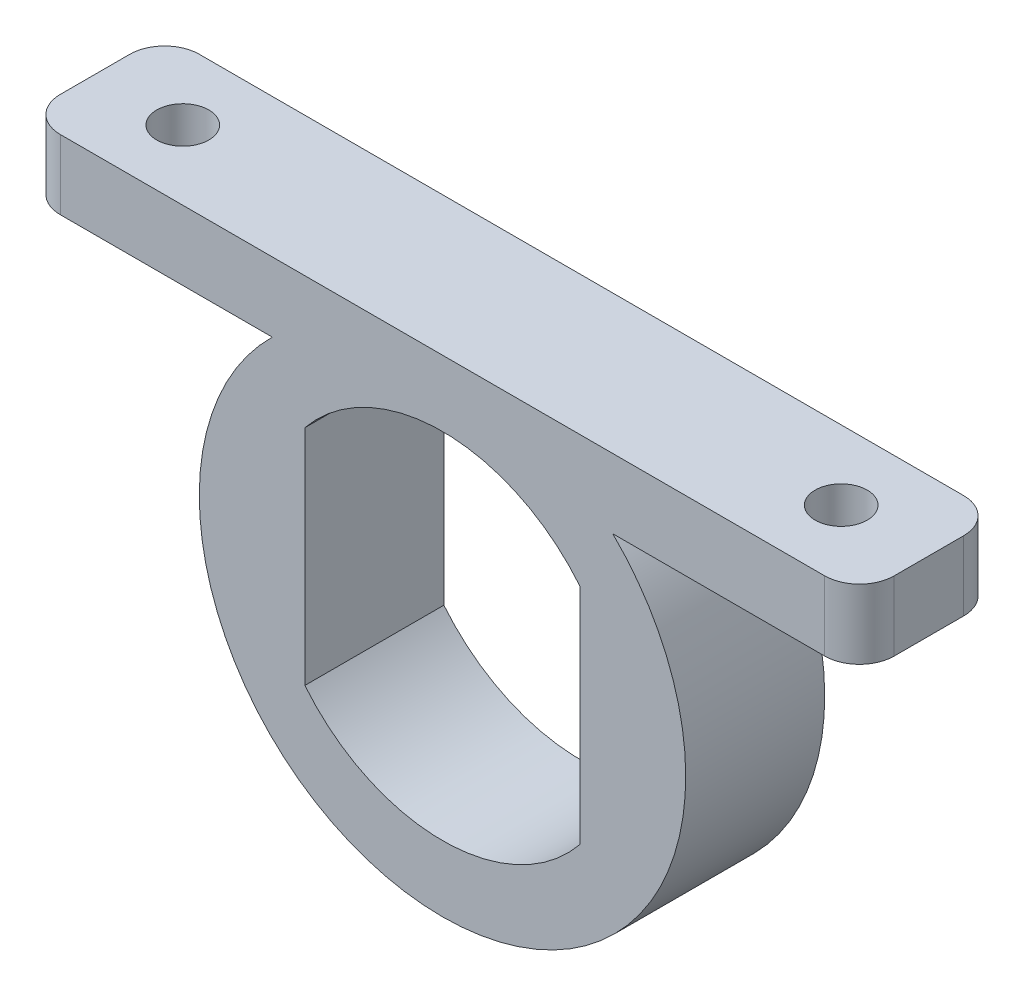
ISO-10303-21;
HEADER;
FILE_DESCRIPTION(('STEP AP214'),'2;1');
FILE_NAME('part.step','',(''),(''),'','','');
FILE_SCHEMA(('AUTOMOTIVE_DESIGN { 1 0 10303 214 1 1 1 1 }'));
ENDSEC;
DATA;
#1=APPLICATION_CONTEXT('core data for automotive mechanical design processes');
#2=APPLICATION_PROTOCOL_DEFINITION('international standard','automotive_design',2000,#1);
#3=PRODUCT_CONTEXT('',#1,'mechanical');
#4=PRODUCT('Part','Part','',(#3));
#5=PRODUCT_RELATED_PRODUCT_CATEGORY('part','',(#4));
#6=PRODUCT_DEFINITION_FORMATION('','',#4);
#7=PRODUCT_DEFINITION_CONTEXT('part definition',#1,'design');
#8=PRODUCT_DEFINITION('design','',#6,#7);
#9=PRODUCT_DEFINITION_SHAPE('','',#8);
#10=(LENGTH_UNIT() NAMED_UNIT(*) SI_UNIT(.MILLI.,.METRE.));
#11=(NAMED_UNIT(*) PLANE_ANGLE_UNIT() SI_UNIT($,.RADIAN.));
#12=(NAMED_UNIT(*) SI_UNIT($,.STERADIAN.) SOLID_ANGLE_UNIT());
#13=UNCERTAINTY_MEASURE_WITH_UNIT(LENGTH_MEASURE(1.E-05),#10,'distance_accuracy_value','');
#14=(GEOMETRIC_REPRESENTATION_CONTEXT(3) GLOBAL_UNCERTAINTY_ASSIGNED_CONTEXT((#13)) GLOBAL_UNIT_ASSIGNED_CONTEXT((#10,
#11,#12)) REPRESENTATION_CONTEXT('',''));
#15=CARTESIAN_POINT('',(0.,0.,0.));
#16=DIRECTION('',(0.,0.,1.));
#17=DIRECTION('',(1.,0.,0.));
#18=AXIS2_PLACEMENT_3D('',#15,#16,#17);
#19=CARTESIAN_POINT('',(0.,14.,8.));
#20=DIRECTION('',(0.,-1.,0.));
#21=DIRECTION('',(1.,0.,0.));
#22=AXIS2_PLACEMENT_3D('',#19,#20,#21);
#23=PLANE('',#22);
#24=CARTESIAN_POINT('',(18.9494897427832,14.,4.));
#25=DIRECTION('',(0.,-1.,0.));
#26=DIRECTION('',(0.,0.,-1.));
#27=AXIS2_PLACEMENT_3D('',#24,#25,#26);
#28=CIRCLE('',#27,1.5);
#29=CARTESIAN_POINT('',(18.9494897427832,14.,2.5));
#30=VERTEX_POINT('',#29);
#31=EDGE_CURVE('E347',#30,#30,#28,.T.);
#32=ORIENTED_EDGE('',*,*,#31,.T.);
#33=EDGE_LOOP('',(#32));
#34=FACE_BOUND('',#33,.T.);
#35=CARTESIAN_POINT('',(-18.9494897427832,14.,4.));
#36=DIRECTION('',(0.,-1.,0.));
#37=DIRECTION('',(0.,0.,-1.));
#38=AXIS2_PLACEMENT_3D('',#35,#36,#37);
#39=CIRCLE('',#38,1.5);
#40=CARTESIAN_POINT('',(-18.9494897427832,14.,2.5));
#41=VERTEX_POINT('',#40);
#42=EDGE_CURVE('E185',#41,#41,#39,.T.);
#43=ORIENTED_EDGE('',*,*,#42,.T.);
#44=EDGE_LOOP('',(#43));
#45=FACE_BOUND('',#44,.T.);
#46=DIRECTION('',(0.,0.,-1.));
#47=VECTOR('',#46,1.);
#48=CARTESIAN_POINT('',(24.,14.,8.));
#49=LINE('',#48,#47);
#50=CARTESIAN_POINT('',(24.,14.,6.));
#51=VERTEX_POINT('',#50);
#52=CARTESIAN_POINT('',(24.,14.,2.));
#53=VERTEX_POINT('',#52);
#54=EDGE_CURVE('E206',#51,#53,#49,.T.);
#55=ORIENTED_EDGE('',*,*,#54,.T.);
#56=CARTESIAN_POINT('',(22.,14.,2.));
#57=DIRECTION('',(0.,-1.,0.));
#58=DIRECTION('',(1.,0.,0.));
#59=AXIS2_PLACEMENT_3D('',#56,#57,#58);
#60=CIRCLE('',#59,2.);
#61=CARTESIAN_POINT('',(22.,14.,0.));
#62=VERTEX_POINT('',#61);
#63=EDGE_CURVE('E251',#53,#62,#60,.F.);
#64=ORIENTED_EDGE('',*,*,#63,.T.);
#65=DIRECTION('',(-1.,0.,0.));
#66=VECTOR('',#65,1.);
#67=CARTESIAN_POINT('',(0.,14.,0.));
#68=LINE('',#67,#66);
#69=CARTESIAN_POINT('',(-22.,14.,0.));
#70=VERTEX_POINT('',#69);
#71=EDGE_CURVE('E199',#62,#70,#68,.T.);
#72=ORIENTED_EDGE('',*,*,#71,.T.);
#73=CARTESIAN_POINT('',(-22.,14.,2.));
#74=DIRECTION('',(0.,-1.,0.));
#75=DIRECTION('',(1.,0.,0.));
#76=AXIS2_PLACEMENT_3D('',#73,#74,#75);
#77=CIRCLE('',#76,2.);
#78=CARTESIAN_POINT('',(-24.,14.,2.));
#79=VERTEX_POINT('',#78);
#80=EDGE_CURVE('E247',#70,#79,#77,.F.);
#81=ORIENTED_EDGE('',*,*,#80,.T.);
#82=DIRECTION('',(0.,0.,-1.));
#83=VECTOR('',#82,1.);
#84=CARTESIAN_POINT('',(-24.,14.,8.));
#85=LINE('',#84,#83);
#86=CARTESIAN_POINT('',(-24.,14.,6.));
#87=VERTEX_POINT('',#86);
#88=EDGE_CURVE('E215',#87,#79,#85,.T.);
#89=ORIENTED_EDGE('',*,*,#88,.F.);
#90=CARTESIAN_POINT('',(-22.,14.,6.));
#91=DIRECTION('',(0.,-1.,0.));
#92=DIRECTION('',(1.,0.,0.));
#93=AXIS2_PLACEMENT_3D('',#90,#91,#92);
#94=CIRCLE('',#93,2.);
#95=CARTESIAN_POINT('',(-22.,14.,8.));
#96=VERTEX_POINT('',#95);
#97=EDGE_CURVE('E245',#87,#96,#94,.F.);
#98=ORIENTED_EDGE('',*,*,#97,.T.);
#99=DIRECTION('',(1.,0.,0.));
#100=VECTOR('',#99,1.);
#101=CARTESIAN_POINT('',(0.,14.,8.));
#102=LINE('',#101,#100);
#103=CARTESIAN_POINT('',(22.,14.,8.));
#104=VERTEX_POINT('',#103);
#105=EDGE_CURVE('E195',#96,#104,#102,.T.);
#106=ORIENTED_EDGE('',*,*,#105,.T.);
#107=CARTESIAN_POINT('',(22.,14.,6.));
#108=DIRECTION('',(0.,-1.,0.));
#109=DIRECTION('',(1.,0.,0.));
#110=AXIS2_PLACEMENT_3D('',#107,#108,#109);
#111=CIRCLE('',#110,2.);
#112=EDGE_CURVE('E249',#104,#51,#111,.F.);
#113=ORIENTED_EDGE('',*,*,#112,.T.);
#114=EDGE_LOOP('',(#55,#64,#72,#81,#89,#98,#106,#113));
#115=FACE_BOUND('',#114,.T.);
#116=ADVANCED_FACE('F47',(#34,#45,#115),#23,.F.);
#117=CARTESIAN_POINT('',(-24.,14.,8.));
#118=DIRECTION('',(1.,0.,0.));
#119=DIRECTION('',(0.,0.,-1.));
#120=AXIS2_PLACEMENT_3D('',#117,#118,#119);
#121=PLANE('',#120);
#122=ORIENTED_EDGE('',*,*,#88,.T.);
#123=DIRECTION('',(0.,-1.,0.));
#124=VECTOR('',#123,1.);
#125=CARTESIAN_POINT('',(-24.,14.,2.));
#126=LINE('',#125,#124);
#127=CARTESIAN_POINT('',(-24.,10.,2.));
#128=VERTEX_POINT('',#127);
#129=EDGE_CURVE('E260',#79,#128,#126,.T.);
#130=ORIENTED_EDGE('',*,*,#129,.T.);
#131=DIRECTION('',(0.,0.,-1.));
#132=VECTOR('',#131,1.);
#133=CARTESIAN_POINT('',(-24.,10.,8.));
#134=LINE('',#133,#132);
#135=CARTESIAN_POINT('',(-24.,10.,6.));
#136=VERTEX_POINT('',#135);
#137=EDGE_CURVE('E219',#136,#128,#134,.T.);
#138=ORIENTED_EDGE('',*,*,#137,.F.);
#139=DIRECTION('',(0.,-1.,0.));
#140=VECTOR('',#139,1.);
#141=CARTESIAN_POINT('',(-24.,14.,6.));
#142=LINE('',#141,#140);
#143=EDGE_CURVE('E258',#136,#87,#142,.F.);
#144=ORIENTED_EDGE('',*,*,#143,.T.);
#145=EDGE_LOOP('',(#122,#130,#138,#144));
#146=FACE_BOUND('',#145,.T.);
#147=ADVANCED_FACE('F262',(#146),#121,.F.);
#148=CARTESIAN_POINT('',(-24.,10.,8.));
#149=DIRECTION('',(0.,1.,0.));
#150=DIRECTION('',(0.,0.,1.));
#151=AXIS2_PLACEMENT_3D('',#148,#149,#150);
#152=PLANE('',#151);
#153=CARTESIAN_POINT('',(-18.9494897427832,10.,4.));
#154=DIRECTION('',(0.,-1.,0.));
#155=DIRECTION('',(0.,0.,-1.));
#156=AXIS2_PLACEMENT_3D('',#153,#154,#155);
#157=CIRCLE('',#156,1.5);
#158=CARTESIAN_POINT('',(-18.9494897427832,10.,2.5));
#159=VERTEX_POINT('',#158);
#160=EDGE_CURVE('E178',#159,#159,#157,.T.);
#161=ORIENTED_EDGE('',*,*,#160,.F.);
#162=EDGE_LOOP('',(#161));
#163=FACE_BOUND('',#162,.T.);
#164=ORIENTED_EDGE('',*,*,#137,.T.);
#165=CARTESIAN_POINT('',(-22.,10.,2.));
#166=DIRECTION('',(0.,1.,0.));
#167=DIRECTION('',(0.,0.,1.));
#168=AXIS2_PLACEMENT_3D('',#165,#166,#167);
#169=CIRCLE('',#168,2.);
#170=CARTESIAN_POINT('',(-22.,10.,0.));
#171=VERTEX_POINT('',#170);
#172=EDGE_CURVE('E13',#128,#171,#169,.F.);
#173=ORIENTED_EDGE('',*,*,#172,.T.);
#174=DIRECTION('',(1.,0.,0.));
#175=VECTOR('',#174,1.);
#176=CARTESIAN_POINT('',(-24.,10.,0.));
#177=LINE('',#176,#175);
#178=CARTESIAN_POINT('',(-9.79795897113272,10.,0.));
#179=VERTEX_POINT('',#178);
#180=EDGE_CURVE('E211',#171,#179,#177,.T.);
#181=ORIENTED_EDGE('',*,*,#180,.T.);
#182=DIRECTION('',(0.,0.,-1.));
#183=VECTOR('',#182,1.);
#184=CARTESIAN_POINT('',(-9.79795897113272,10.,8.));
#185=LINE('',#184,#183);
#186=CARTESIAN_POINT('',(-9.79795897113272,10.,8.));
#187=VERTEX_POINT('',#186);
#188=EDGE_CURVE('E221',#187,#179,#185,.T.);
#189=ORIENTED_EDGE('',*,*,#188,.F.);
#190=DIRECTION('',(1.,0.,0.));
#191=VECTOR('',#190,1.);
#192=CARTESIAN_POINT('',(-24.,10.,8.));
#193=LINE('',#192,#191);
#194=CARTESIAN_POINT('',(-22.,10.,8.));
#195=VERTEX_POINT('',#194);
#196=EDGE_CURVE('E204',#195,#187,#193,.T.);
#197=ORIENTED_EDGE('',*,*,#196,.F.);
#198=CARTESIAN_POINT('',(-22.,10.,6.));
#199=DIRECTION('',(0.,1.,0.));
#200=DIRECTION('',(0.,0.,1.));
#201=AXIS2_PLACEMENT_3D('',#198,#199,#200);
#202=CIRCLE('',#201,2.);
#203=EDGE_CURVE('E55',#195,#136,#202,.F.);
#204=ORIENTED_EDGE('',*,*,#203,.T.);
#205=EDGE_LOOP('',(#164,#173,#181,#189,#197,#204));
#206=FACE_BOUND('',#205,.T.);
#207=ADVANCED_FACE('F266',(#163,#206),#152,.F.);
#208=CARTESIAN_POINT('',(0.,0.,8.));
#209=DIRECTION('',(0.,0.,-1.));
#210=DIRECTION('',(-1.,0.,0.));
#211=AXIS2_PLACEMENT_3D('',#208,#209,#210);
#212=CYLINDRICAL_SURFACE('',#211,14.);
#213=CARTESIAN_POINT('',(0.,0.,0.));
#214=DIRECTION('',(0.,0.,1.));
#215=DIRECTION('',(1.,0.,0.));
#216=AXIS2_PLACEMENT_3D('',#213,#214,#215);
#217=CIRCLE('',#216,14.);
#218=CARTESIAN_POINT('',(9.79795897113271,10.,0.));
#219=VERTEX_POINT('',#218);
#220=EDGE_CURVE('E208',#179,#219,#217,.T.);
#221=ORIENTED_EDGE('',*,*,#220,.T.);
#222=DIRECTION('',(0.,0.,-1.));
#223=VECTOR('',#222,1.);
#224=CARTESIAN_POINT('',(9.79795897113271,10.,8.));
#225=LINE('',#224,#223);
#226=CARTESIAN_POINT('',(9.79795897113271,10.,8.));
#227=VERTEX_POINT('',#226);
#228=EDGE_CURVE('E224',#227,#219,#225,.T.);
#229=ORIENTED_EDGE('',*,*,#228,.F.);
#230=CARTESIAN_POINT('',(0.,0.,8.));
#231=DIRECTION('',(0.,0.,1.));
#232=DIRECTION('',(1.,0.,0.));
#233=AXIS2_PLACEMENT_3D('',#230,#231,#232);
#234=CIRCLE('',#233,14.);
#235=EDGE_CURVE('E201',#187,#227,#234,.T.);
#236=ORIENTED_EDGE('',*,*,#235,.F.);
#237=ORIENTED_EDGE('',*,*,#188,.T.);
#238=EDGE_LOOP('',(#221,#229,#236,#237));
#239=FACE_BOUND('',#238,.T.);
#240=ADVANCED_FACE('F298',(#239),#212,.T.);
#241=CARTESIAN_POINT('',(24.,10.,8.));
#242=DIRECTION('',(0.,-1.,0.));
#243=DIRECTION('',(0.,0.,-1.));
#244=AXIS2_PLACEMENT_3D('',#241,#242,#243);
#245=PLANE('',#244);
#246=CARTESIAN_POINT('',(18.9494897427832,10.,4.));
#247=DIRECTION('',(0.,-1.,0.));
#248=DIRECTION('',(0.,0.,-1.));
#249=AXIS2_PLACEMENT_3D('',#246,#247,#248);
#250=CIRCLE('',#249,1.5);
#251=CARTESIAN_POINT('',(18.9494897427832,10.,2.5));
#252=VERTEX_POINT('',#251);
#253=EDGE_CURVE('E350',#252,#252,#250,.T.);
#254=ORIENTED_EDGE('',*,*,#253,.F.);
#255=EDGE_LOOP('',(#254));
#256=FACE_BOUND('',#255,.T.);
#257=DIRECTION('',(-1.,0.,0.));
#258=VECTOR('',#257,1.);
#259=CARTESIAN_POINT('',(24.,10.,0.));
#260=LINE('',#259,#258);
#261=CARTESIAN_POINT('',(22.,10.,0.));
#262=VERTEX_POINT('',#261);
#263=EDGE_CURVE('E191',#262,#219,#260,.T.);
#264=ORIENTED_EDGE('',*,*,#263,.F.);
#265=CARTESIAN_POINT('',(22.,10.,2.));
#266=DIRECTION('',(0.,-1.,0.));
#267=DIRECTION('',(0.,0.,-1.));
#268=AXIS2_PLACEMENT_3D('',#265,#266,#267);
#269=CIRCLE('',#268,2.);
#270=CARTESIAN_POINT('',(24.,10.,2.));
#271=VERTEX_POINT('',#270);
#272=EDGE_CURVE('E238',#262,#271,#269,.T.);
#273=ORIENTED_EDGE('',*,*,#272,.T.);
#274=DIRECTION('',(0.,0.,-1.));
#275=VECTOR('',#274,1.);
#276=CARTESIAN_POINT('',(24.,10.,8.));
#277=LINE('',#276,#275);
#278=CARTESIAN_POINT('',(24.,10.,6.));
#279=VERTEX_POINT('',#278);
#280=EDGE_CURVE('E227',#279,#271,#277,.T.);
#281=ORIENTED_EDGE('',*,*,#280,.F.);
#282=CARTESIAN_POINT('',(22.,10.,6.));
#283=DIRECTION('',(0.,-1.,0.));
#284=DIRECTION('',(0.,0.,-1.));
#285=AXIS2_PLACEMENT_3D('',#282,#283,#284);
#286=CIRCLE('',#285,2.);
#287=CARTESIAN_POINT('',(22.,10.,8.));
#288=VERTEX_POINT('',#287);
#289=EDGE_CURVE('E236',#279,#288,#286,.T.);
#290=ORIENTED_EDGE('',*,*,#289,.T.);
#291=DIRECTION('',(-1.,0.,0.));
#292=VECTOR('',#291,1.);
#293=CARTESIAN_POINT('',(24.,10.,8.));
#294=LINE('',#293,#292);
#295=EDGE_CURVE('E198',#288,#227,#294,.T.);
#296=ORIENTED_EDGE('',*,*,#295,.T.);
#297=ORIENTED_EDGE('',*,*,#228,.T.);
#298=EDGE_LOOP('',(#264,#273,#281,#290,#296,#297));
#299=FACE_BOUND('',#298,.T.);
#300=ADVANCED_FACE('F282',(#256,#299),#245,.T.);
#301=CARTESIAN_POINT('',(24.,14.,8.));
#302=DIRECTION('',(1.,0.,0.));
#303=DIRECTION('',(0.,0.,-1.));
#304=AXIS2_PLACEMENT_3D('',#301,#302,#303);
#305=PLANE('',#304);
#306=ORIENTED_EDGE('',*,*,#280,.T.);
#307=DIRECTION('',(0.,-1.,0.));
#308=VECTOR('',#307,1.);
#309=CARTESIAN_POINT('',(24.,14.,2.));
#310=LINE('',#309,#308);
#311=EDGE_CURVE('E243',#271,#53,#310,.F.);
#312=ORIENTED_EDGE('',*,*,#311,.T.);
#313=ORIENTED_EDGE('',*,*,#54,.F.);
#314=DIRECTION('',(0.,-1.,0.));
#315=VECTOR('',#314,1.);
#316=CARTESIAN_POINT('',(24.,14.,6.));
#317=LINE('',#316,#315);
#318=EDGE_CURVE('E240',#51,#279,#317,.T.);
#319=ORIENTED_EDGE('',*,*,#318,.T.);
#320=EDGE_LOOP('',(#306,#312,#313,#319));
#321=FACE_BOUND('',#320,.T.);
#322=ADVANCED_FACE('F284',(#321),#305,.T.);
#323=CARTESIAN_POINT('',(0.,0.,8.));
#324=DIRECTION('',(0.,0.,1.));
#325=DIRECTION('',(1.,0.,0.));
#326=AXIS2_PLACEMENT_3D('',#323,#324,#325);
#327=PLANE('',#326);
#328=CARTESIAN_POINT('',(0.,0.,8.));
#329=DIRECTION('',(0.,0.,1.));
#330=DIRECTION('',(-1.,0.,0.));
#331=AXIS2_PLACEMENT_3D('',#328,#329,#330);
#332=CIRCLE('',#331,10.2);
#333=CARTESIAN_POINT('',(7.92208148152996,6.425,8.));
#334=VERTEX_POINT('',#333);
#335=CARTESIAN_POINT('',(-7.92208148152996,6.425,8.));
#336=VERTEX_POINT('',#335);
#337=EDGE_CURVE('E154',#334,#336,#332,.T.);
#338=ORIENTED_EDGE('',*,*,#337,.F.);
#339=DIRECTION('',(0.,1.,0.));
#340=VECTOR('',#339,1.);
#341=CARTESIAN_POINT('',(7.92208148152996,6.425,8.));
#342=LINE('',#341,#340);
#343=CARTESIAN_POINT('',(7.92208148152996,-6.425,8.));
#344=VERTEX_POINT('',#343);
#345=EDGE_CURVE('E172',#344,#334,#342,.T.);
#346=ORIENTED_EDGE('',*,*,#345,.F.);
#347=CARTESIAN_POINT('',(0.,0.,8.));
#348=DIRECTION('',(0.,0.,1.));
#349=DIRECTION('',(1.,0.,0.));
#350=AXIS2_PLACEMENT_3D('',#347,#348,#349);
#351=CIRCLE('',#350,10.2);
#352=CARTESIAN_POINT('',(-7.92208148152996,-6.425,8.));
#353=VERTEX_POINT('',#352);
#354=EDGE_CURVE('E175',#353,#344,#351,.T.);
#355=ORIENTED_EDGE('',*,*,#354,.F.);
#356=DIRECTION('',(0.,-1.,0.));
#357=VECTOR('',#356,1.);
#358=CARTESIAN_POINT('',(-7.92208148152996,6.425,8.));
#359=LINE('',#358,#357);
#360=EDGE_CURVE('E184',#336,#353,#359,.T.);
#361=ORIENTED_EDGE('',*,*,#360,.F.);
#362=EDGE_LOOP('',(#338,#346,#355,#361));
#363=FACE_BOUND('',#362,.T.);
#364=ORIENTED_EDGE('',*,*,#295,.F.);
#365=DIRECTION('',(0.,-1.,0.));
#366=VECTOR('',#365,1.);
#367=CARTESIAN_POINT('',(22.,0.,8.));
#368=LINE('',#367,#366);
#369=EDGE_CURVE('E256',#288,#104,#368,.F.);
#370=ORIENTED_EDGE('',*,*,#369,.T.);
#371=ORIENTED_EDGE('',*,*,#105,.F.);
#372=DIRECTION('',(0.,-1.,0.));
#373=VECTOR('',#372,1.);
#374=CARTESIAN_POINT('',(-22.,10.,8.));
#375=LINE('',#374,#373);
#376=EDGE_CURVE('E253',#96,#195,#375,.T.);
#377=ORIENTED_EDGE('',*,*,#376,.T.);
#378=ORIENTED_EDGE('',*,*,#196,.T.);
#379=ORIENTED_EDGE('',*,*,#235,.T.);
#380=EDGE_LOOP('',(#364,#370,#371,#377,#378,#379));
#381=FACE_BOUND('',#380,.T.);
#382=ADVANCED_FACE('F293',(#363,#381),#327,.T.);
#383=CARTESIAN_POINT('',(0.,0.,0.));
#384=DIRECTION('',(0.,0.,1.));
#385=DIRECTION('',(1.,0.,0.));
#386=AXIS2_PLACEMENT_3D('',#383,#384,#385);
#387=PLANE('',#386);
#388=DIRECTION('',(0.,1.,0.));
#389=VECTOR('',#388,1.);
#390=CARTESIAN_POINT('',(7.92208148152996,6.425,0.));
#391=LINE('',#390,#389);
#392=CARTESIAN_POINT('',(7.92208148152996,-6.425,0.));
#393=VERTEX_POINT('',#392);
#394=CARTESIAN_POINT('',(7.92208148152996,6.425,0.));
#395=VERTEX_POINT('',#394);
#396=EDGE_CURVE('E159',#393,#395,#391,.T.);
#397=ORIENTED_EDGE('',*,*,#396,.T.);
#398=CARTESIAN_POINT('',(0.,0.,0.));
#399=DIRECTION('',(0.,0.,1.));
#400=DIRECTION('',(-1.,0.,0.));
#401=AXIS2_PLACEMENT_3D('',#398,#399,#400);
#402=CIRCLE('',#401,10.2);
#403=CARTESIAN_POINT('',(-7.92208148152996,6.425,0.));
#404=VERTEX_POINT('',#403);
#405=EDGE_CURVE('E151',#395,#404,#402,.T.);
#406=ORIENTED_EDGE('',*,*,#405,.T.);
#407=DIRECTION('',(0.,-1.,0.));
#408=VECTOR('',#407,1.);
#409=CARTESIAN_POINT('',(-7.92208148152996,6.425,0.));
#410=LINE('',#409,#408);
#411=CARTESIAN_POINT('',(-7.92208148152996,-6.425,0.));
#412=VERTEX_POINT('',#411);
#413=EDGE_CURVE('E163',#404,#412,#410,.T.);
#414=ORIENTED_EDGE('',*,*,#413,.T.);
#415=CARTESIAN_POINT('',(0.,0.,0.));
#416=DIRECTION('',(0.,0.,1.));
#417=DIRECTION('',(1.,0.,0.));
#418=AXIS2_PLACEMENT_3D('',#415,#416,#417);
#419=CIRCLE('',#418,10.2);
#420=EDGE_CURVE('E167',#412,#393,#419,.T.);
#421=ORIENTED_EDGE('',*,*,#420,.T.);
#422=EDGE_LOOP('',(#397,#406,#414,#421));
#423=FACE_BOUND('',#422,.T.);
#424=ORIENTED_EDGE('',*,*,#71,.F.);
#425=DIRECTION('',(0.,-1.,0.));
#426=VECTOR('',#425,1.);
#427=CARTESIAN_POINT('',(22.,10.,0.));
#428=LINE('',#427,#426);
#429=EDGE_CURVE('E233',#62,#262,#428,.T.);
#430=ORIENTED_EDGE('',*,*,#429,.T.);
#431=ORIENTED_EDGE('',*,*,#263,.T.);
#432=ORIENTED_EDGE('',*,*,#220,.F.);
#433=ORIENTED_EDGE('',*,*,#180,.F.);
#434=DIRECTION('',(0.,-1.,0.));
#435=VECTOR('',#434,1.);
#436=CARTESIAN_POINT('',(-22.,0.,0.));
#437=LINE('',#436,#435);
#438=EDGE_CURVE('E218',#171,#70,#437,.F.);
#439=ORIENTED_EDGE('',*,*,#438,.T.);
#440=EDGE_LOOP('',(#424,#430,#431,#432,#433,#439));
#441=FACE_BOUND('',#440,.T.);
#442=ADVANCED_FACE('F169',(#423,#441),#387,.F.);
#443=CARTESIAN_POINT('',(0.,0.,0.));
#444=DIRECTION('',(0.,0.,1.));
#445=DIRECTION('',(1.,0.,0.));
#446=AXIS2_PLACEMENT_3D('',#443,#444,#445);
#447=CYLINDRICAL_SURFACE('',#446,10.2);
#448=ORIENTED_EDGE('',*,*,#337,.T.);
#449=DIRECTION('',(0.,0.,1.));
#450=VECTOR('',#449,1.);
#451=CARTESIAN_POINT('',(-7.92208148152996,6.425,0.));
#452=LINE('',#451,#450);
#453=EDGE_CURVE('E147',#404,#336,#452,.T.);
#454=ORIENTED_EDGE('',*,*,#453,.F.);
#455=ORIENTED_EDGE('',*,*,#405,.F.);
#456=DIRECTION('',(0.,0.,1.));
#457=VECTOR('',#456,1.);
#458=CARTESIAN_POINT('',(7.92208148152996,6.425,0.));
#459=LINE('',#458,#457);
#460=EDGE_CURVE('E189',#395,#334,#459,.T.);
#461=ORIENTED_EDGE('',*,*,#460,.T.);
#462=EDGE_LOOP('',(#448,#454,#455,#461));
#463=FACE_BOUND('',#462,.T.);
#464=ADVANCED_FACE('F149',(#463),#447,.F.);
#465=CARTESIAN_POINT('',(7.92208148152996,6.425,0.));
#466=DIRECTION('',(1.,0.,0.));
#467=DIRECTION('',(0.,1.,0.));
#468=AXIS2_PLACEMENT_3D('',#465,#466,#467);
#469=PLANE('',#468);
#470=ORIENTED_EDGE('',*,*,#345,.T.);
#471=ORIENTED_EDGE('',*,*,#460,.F.);
#472=ORIENTED_EDGE('',*,*,#396,.F.);
#473=DIRECTION('',(0.,0.,1.));
#474=VECTOR('',#473,1.);
#475=CARTESIAN_POINT('',(7.92208148152996,-6.425,0.));
#476=LINE('',#475,#474);
#477=EDGE_CURVE('E192',#393,#344,#476,.T.);
#478=ORIENTED_EDGE('',*,*,#477,.T.);
#479=EDGE_LOOP('',(#470,#471,#472,#478));
#480=FACE_BOUND('',#479,.T.);
#481=ADVANCED_FACE('F326',(#480),#469,.F.);
#482=CARTESIAN_POINT('',(0.,0.,0.));
#483=DIRECTION('',(0.,0.,1.));
#484=DIRECTION('',(1.,0.,0.));
#485=AXIS2_PLACEMENT_3D('',#482,#483,#484);
#486=CYLINDRICAL_SURFACE('',#485,10.2);
#487=ORIENTED_EDGE('',*,*,#354,.T.);
#488=ORIENTED_EDGE('',*,*,#477,.F.);
#489=ORIENTED_EDGE('',*,*,#420,.F.);
#490=DIRECTION('',(0.,0.,1.));
#491=VECTOR('',#490,1.);
#492=CARTESIAN_POINT('',(-7.92208148152996,-6.425,0.));
#493=LINE('',#492,#491);
#494=EDGE_CURVE('E158',#412,#353,#493,.T.);
#495=ORIENTED_EDGE('',*,*,#494,.T.);
#496=EDGE_LOOP('',(#487,#488,#489,#495));
#497=FACE_BOUND('',#496,.T.);
#498=ADVANCED_FACE('F329',(#497),#486,.F.);
#499=CARTESIAN_POINT('',(-7.92208148152996,6.425,0.));
#500=DIRECTION('',(-1.,0.,0.));
#501=DIRECTION('',(0.,0.,1.));
#502=AXIS2_PLACEMENT_3D('',#499,#500,#501);
#503=PLANE('',#502);
#504=ORIENTED_EDGE('',*,*,#360,.T.);
#505=ORIENTED_EDGE('',*,*,#494,.F.);
#506=ORIENTED_EDGE('',*,*,#413,.F.);
#507=ORIENTED_EDGE('',*,*,#453,.T.);
#508=EDGE_LOOP('',(#504,#505,#506,#507));
#509=FACE_BOUND('',#508,.T.);
#510=ADVANCED_FACE('F164',(#509),#503,.F.);
#511=CARTESIAN_POINT('',(22.,0.,2.));
#512=DIRECTION('',(0.,1.,0.));
#513=DIRECTION('',(0.,0.,1.));
#514=AXIS2_PLACEMENT_3D('',#511,#512,#513);
#515=CYLINDRICAL_SURFACE('',#514,2.);
#516=ORIENTED_EDGE('',*,*,#63,.F.);
#517=ORIENTED_EDGE('',*,*,#311,.F.);
#518=ORIENTED_EDGE('',*,*,#272,.F.);
#519=ORIENTED_EDGE('',*,*,#429,.F.);
#520=EDGE_LOOP('',(#516,#517,#518,#519));
#521=FACE_BOUND('',#520,.T.);
#522=ADVANCED_FACE('F278',(#521),#515,.T.);
#523=CARTESIAN_POINT('',(22.,14.,6.));
#524=DIRECTION('',(0.,-1.,0.));
#525=DIRECTION('',(0.,0.,-1.));
#526=AXIS2_PLACEMENT_3D('',#523,#524,#525);
#527=CYLINDRICAL_SURFACE('',#526,2.);
#528=ORIENTED_EDGE('',*,*,#112,.F.);
#529=ORIENTED_EDGE('',*,*,#369,.F.);
#530=ORIENTED_EDGE('',*,*,#289,.F.);
#531=ORIENTED_EDGE('',*,*,#318,.F.);
#532=EDGE_LOOP('',(#528,#529,#530,#531));
#533=FACE_BOUND('',#532,.T.);
#534=ADVANCED_FACE('F289',(#533),#527,.T.);
#535=CARTESIAN_POINT('',(-22.,14.,2.));
#536=DIRECTION('',(0.,-1.,0.));
#537=DIRECTION('',(0.,0.,-1.));
#538=AXIS2_PLACEMENT_3D('',#535,#536,#537);
#539=CYLINDRICAL_SURFACE('',#538,2.);
#540=ORIENTED_EDGE('',*,*,#80,.F.);
#541=ORIENTED_EDGE('',*,*,#438,.F.);
#542=ORIENTED_EDGE('',*,*,#172,.F.);
#543=ORIENTED_EDGE('',*,*,#129,.F.);
#544=EDGE_LOOP('',(#540,#541,#542,#543));
#545=FACE_BOUND('',#544,.T.);
#546=ADVANCED_FACE('F271',(#545),#539,.T.);
#547=CARTESIAN_POINT('',(-22.,0.,6.));
#548=DIRECTION('',(0.,1.,0.));
#549=DIRECTION('',(0.,0.,1.));
#550=AXIS2_PLACEMENT_3D('',#547,#548,#549);
#551=CYLINDRICAL_SURFACE('',#550,2.);
#552=ORIENTED_EDGE('',*,*,#97,.F.);
#553=ORIENTED_EDGE('',*,*,#143,.F.);
#554=ORIENTED_EDGE('',*,*,#203,.F.);
#555=ORIENTED_EDGE('',*,*,#376,.F.);
#556=EDGE_LOOP('',(#552,#553,#554,#555));
#557=FACE_BOUND('',#556,.T.);
#558=ADVANCED_FACE('F49',(#557),#551,.T.);
#559=CARTESIAN_POINT('',(-18.9494897427832,14.,4.));
#560=DIRECTION('',(0.,-1.,0.));
#561=DIRECTION('',(0.,0.,-1.));
#562=AXIS2_PLACEMENT_3D('',#559,#560,#561);
#563=CYLINDRICAL_SURFACE('',#562,1.5);
#564=ORIENTED_EDGE('',*,*,#42,.F.);
#565=EDGE_LOOP('',(#564));
#566=FACE_BOUND('',#565,.T.);
#567=ORIENTED_EDGE('',*,*,#160,.T.);
#568=EDGE_LOOP('',(#567));
#569=FACE_BOUND('',#568,.T.);
#570=ADVANCED_FACE('F336',(#566,#569),#563,.F.);
#571=CARTESIAN_POINT('',(18.9494897427832,14.,4.));
#572=DIRECTION('',(0.,-1.,0.));
#573=DIRECTION('',(0.,0.,-1.));
#574=AXIS2_PLACEMENT_3D('',#571,#572,#573);
#575=CYLINDRICAL_SURFACE('',#574,1.5);
#576=ORIENTED_EDGE('',*,*,#31,.F.);
#577=EDGE_LOOP('',(#576));
#578=FACE_BOUND('',#577,.T.);
#579=ORIENTED_EDGE('',*,*,#253,.T.);
#580=EDGE_LOOP('',(#579));
#581=FACE_BOUND('',#580,.T.);
#582=ADVANCED_FACE('F339',(#578,#581),#575,.F.);
#583=CLOSED_SHELL('',(#116,#147,#207,#240,#300,#322,#382,#442,#464,#481,#498,#510,#522,#534,
#546,#558,#570,#582));
#584=MANIFOLD_SOLID_BREP('B2',#583);
#585=ADVANCED_BREP_SHAPE_REPRESENTATION('',(#18,#584),#14);
#586=SHAPE_DEFINITION_REPRESENTATION(#9,#585);
ENDSEC;
END-ISO-10303-21;
